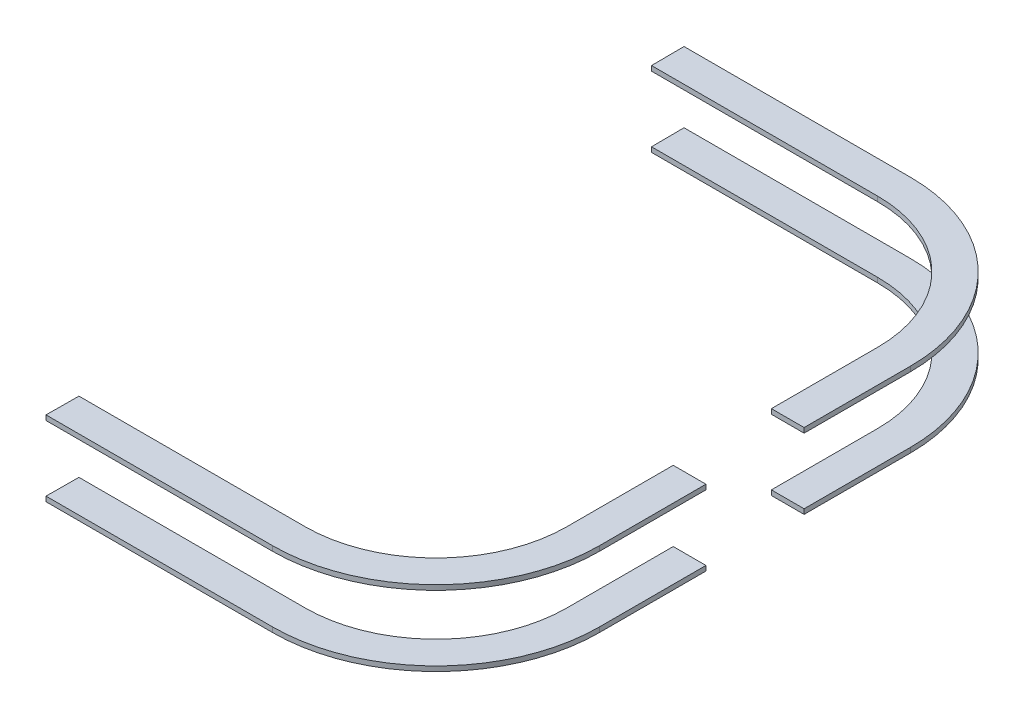
ISO-10303-21;
HEADER;
FILE_DESCRIPTION(('STEP AP214'),'2;1');
FILE_NAME('part.step','',(''),(''),'','','');
FILE_SCHEMA(('AUTOMOTIVE_DESIGN { 1 0 10303 214 1 1 1 1 }'));
ENDSEC;
DATA;
#1=APPLICATION_CONTEXT('core data for automotive mechanical design processes');
#2=APPLICATION_PROTOCOL_DEFINITION('international standard','automotive_design',2000,#1);
#3=PRODUCT_CONTEXT('',#1,'mechanical');
#4=PRODUCT('Part','Part','',(#3));
#5=PRODUCT_RELATED_PRODUCT_CATEGORY('part','',(#4));
#6=PRODUCT_DEFINITION_FORMATION('','',#4);
#7=PRODUCT_DEFINITION_CONTEXT('part definition',#1,'design');
#8=PRODUCT_DEFINITION('design','',#6,#7);
#9=PRODUCT_DEFINITION_SHAPE('','',#8);
#10=(LENGTH_UNIT() NAMED_UNIT(*) SI_UNIT(.MILLI.,.METRE.));
#11=(NAMED_UNIT(*) PLANE_ANGLE_UNIT() SI_UNIT($,.RADIAN.));
#12=(NAMED_UNIT(*) SI_UNIT($,.STERADIAN.) SOLID_ANGLE_UNIT());
#13=UNCERTAINTY_MEASURE_WITH_UNIT(LENGTH_MEASURE(1.E-05),#10,'distance_accuracy_value','');
#14=(GEOMETRIC_REPRESENTATION_CONTEXT(3) GLOBAL_UNCERTAINTY_ASSIGNED_CONTEXT((#13)) GLOBAL_UNIT_ASSIGNED_CONTEXT((#10,
#11,#12)) REPRESENTATION_CONTEXT('',''));
#15=CARTESIAN_POINT('',(0.,0.,0.));
#16=DIRECTION('',(0.,0.,1.));
#17=DIRECTION('',(1.,0.,0.));
#18=AXIS2_PLACEMENT_3D('',#15,#16,#17);
#19=CARTESIAN_POINT('',(-0.0726145105182899,-40.,9.99973635316753));
#20=DIRECTION('',(0.999973635316763,0.,0.00726145105182906));
#21=DIRECTION('',(0.00726145105182906,0.,-0.999973635316763));
#22=AXIS2_PLACEMENT_3D('',#19,#20,#21);
#23=PLANE('',#22);
#24=DIRECTION('',(-0.00726145105182906,0.,0.999973635316763));
#25=VECTOR('',#24,1.);
#26=CARTESIAN_POINT('',(-0.0726145105182899,-43.,9.99973635316753));
#27=LINE('',#26,#25);
#28=CARTESIAN_POINT('',(0.0726145105182899,-43.,-9.99973635316753));
#29=VERTEX_POINT('',#28);
#30=CARTESIAN_POINT('',(-0.0726145105182899,-43.,9.99973635316753));
#31=VERTEX_POINT('',#30);
#32=EDGE_CURVE('E229',#29,#31,#27,.T.);
#33=ORIENTED_EDGE('',*,*,#32,.T.);
#34=DIRECTION('',(0.,-1.,0.));
#35=VECTOR('',#34,1.);
#36=CARTESIAN_POINT('',(-0.0726145105182899,-40.,9.99973635316753));
#37=LINE('',#36,#35);
#38=CARTESIAN_POINT('',(-0.0726145105182899,-40.,9.99973635316753));
#39=VERTEX_POINT('',#38);
#40=EDGE_CURVE('E12',#39,#31,#37,.T.);
#41=ORIENTED_EDGE('',*,*,#40,.F.);
#42=DIRECTION('',(-0.00726145105182906,0.,0.999973635316763));
#43=VECTOR('',#42,1.);
#44=CARTESIAN_POINT('',(-0.0726145105182899,-40.,9.99973635316753));
#45=LINE('',#44,#43);
#46=CARTESIAN_POINT('',(0.0726145105182899,-40.,-9.99973635316753));
#47=VERTEX_POINT('',#46);
#48=EDGE_CURVE('E265',#47,#39,#45,.T.);
#49=ORIENTED_EDGE('',*,*,#48,.F.);
#50=DIRECTION('',(0.,-1.,0.));
#51=VECTOR('',#50,1.);
#52=CARTESIAN_POINT('',(0.0726145105182899,-40.,-9.99973635316753));
#53=LINE('',#52,#51);
#54=EDGE_CURVE('E266',#47,#29,#53,.T.);
#55=ORIENTED_EDGE('',*,*,#54,.T.);
#56=EDGE_LOOP('',(#33,#41,#49,#55));
#57=FACE_BOUND('',#56,.T.);
#58=ADVANCED_FACE('F56',(#57),#23,.F.);
#59=CARTESIAN_POINT('',(138.327385489482,-40.,9.99973635316748));
#60=DIRECTION('',(0.,0.,-1.));
#61=DIRECTION('',(-1.,0.,0.));
#62=AXIS2_PLACEMENT_3D('',#59,#60,#61);
#63=PLANE('',#62);
#64=DIRECTION('',(1.,0.,0.));
#65=VECTOR('',#64,1.);
#66=CARTESIAN_POINT('',(138.327385489482,-43.,9.99973635316748));
#67=LINE('',#66,#65);
#68=CARTESIAN_POINT('',(138.327385489482,-43.,9.99973635316746));
#69=VERTEX_POINT('',#68);
#70=EDGE_CURVE('E233',#31,#69,#67,.T.);
#71=ORIENTED_EDGE('',*,*,#70,.T.);
#72=DIRECTION('',(0.,-1.,0.));
#73=VECTOR('',#72,1.);
#74=CARTESIAN_POINT('',(138.327385489482,-40.,9.99973635316746));
#75=LINE('',#74,#73);
#76=CARTESIAN_POINT('',(138.327385489482,-40.,9.99973635316746));
#77=VERTEX_POINT('',#76);
#78=EDGE_CURVE('E67',#77,#69,#75,.T.);
#79=ORIENTED_EDGE('',*,*,#78,.F.);
#80=DIRECTION('',(1.,0.,0.));
#81=VECTOR('',#80,1.);
#82=CARTESIAN_POINT('',(99.9273854894817,-40.,9.99973635316753));
#83=LINE('',#82,#81);
#84=EDGE_CURVE('E443',#39,#77,#83,.T.);
#85=ORIENTED_EDGE('',*,*,#84,.F.);
#86=ORIENTED_EDGE('',*,*,#40,.T.);
#87=EDGE_LOOP('',(#71,#79,#85,#86));
#88=FACE_BOUND('',#87,.T.);
#89=ADVANCED_FACE('F403',(#88),#63,.F.);
#90=CARTESIAN_POINT('',(138.327385489482,-40.,-90.0002636468325));
#91=DIRECTION('',(0.,-1.,0.));
#92=DIRECTION('',(0.,0.,-1.));
#93=AXIS2_PLACEMENT_3D('',#90,#91,#92);
#94=CYLINDRICAL_SURFACE('',#93,100.);
#95=CARTESIAN_POINT('',(138.327385489482,-43.,-90.0002636468325));
#96=DIRECTION('',(0.,1.,0.));
#97=DIRECTION('',(0.,0.,-1.));
#98=AXIS2_PLACEMENT_3D('',#95,#96,#97);
#99=CIRCLE('',#98,100.);
#100=CARTESIAN_POINT('',(238.327385489482,-43.,-90.0002636468325));
#101=VERTEX_POINT('',#100);
#102=EDGE_CURVE('E240',#69,#101,#99,.T.);
#103=ORIENTED_EDGE('',*,*,#102,.T.);
#104=DIRECTION('',(0.,-1.,0.));
#105=VECTOR('',#104,1.);
#106=CARTESIAN_POINT('',(238.327385489482,-40.,-90.0002636468325));
#107=LINE('',#106,#105);
#108=CARTESIAN_POINT('',(238.327385489482,-40.,-90.0002636468325));
#109=VERTEX_POINT('',#108);
#110=EDGE_CURVE('E285',#109,#101,#107,.T.);
#111=ORIENTED_EDGE('',*,*,#110,.F.);
#112=CARTESIAN_POINT('',(138.327385489482,-40.,-90.0002636468325));
#113=DIRECTION('',(0.,1.,0.));
#114=DIRECTION('',(0.,0.,-1.));
#115=AXIS2_PLACEMENT_3D('',#112,#113,#114);
#116=CIRCLE('',#115,100.);
#117=EDGE_CURVE('E450',#77,#109,#116,.T.);
#118=ORIENTED_EDGE('',*,*,#117,.F.);
#119=ORIENTED_EDGE('',*,*,#78,.T.);
#120=EDGE_LOOP('',(#103,#111,#118,#119));
#121=FACE_BOUND('',#120,.T.);
#122=ADVANCED_FACE('F406',(#121),#94,.T.);
#123=CARTESIAN_POINT('',(238.327385489482,-40.,-95.0002636468325));
#124=DIRECTION('',(-1.,0.,0.));
#125=DIRECTION('',(0.,0.,1.));
#126=AXIS2_PLACEMENT_3D('',#123,#124,#125);
#127=PLANE('',#126);
#128=DIRECTION('',(0.,0.,-1.));
#129=VECTOR('',#128,1.);
#130=CARTESIAN_POINT('',(238.327385489482,-43.,-95.0002636468325));
#131=LINE('',#130,#129);
#132=CARTESIAN_POINT('',(238.327385489482,-43.,-155.000263646832));
#133=VERTEX_POINT('',#132);
#134=EDGE_CURVE('E248',#101,#133,#131,.T.);
#135=ORIENTED_EDGE('',*,*,#134,.T.);
#136=DIRECTION('',(0.,-1.,0.));
#137=VECTOR('',#136,1.);
#138=CARTESIAN_POINT('',(238.327385489482,-40.,-155.000263646832));
#139=LINE('',#138,#137);
#140=CARTESIAN_POINT('',(238.327385489482,-40.,-155.000263646832));
#141=VERTEX_POINT('',#140);
#142=EDGE_CURVE('E281',#141,#133,#139,.T.);
#143=ORIENTED_EDGE('',*,*,#142,.F.);
#144=DIRECTION('',(0.,0.,-1.));
#145=VECTOR('',#144,1.);
#146=CARTESIAN_POINT('',(238.327385489482,-40.,-95.0002636468325));
#147=LINE('',#146,#145);
#148=EDGE_CURVE('E453',#109,#141,#147,.T.);
#149=ORIENTED_EDGE('',*,*,#148,.F.);
#150=ORIENTED_EDGE('',*,*,#110,.T.);
#151=EDGE_LOOP('',(#135,#143,#149,#150));
#152=FACE_BOUND('',#151,.T.);
#153=ADVANCED_FACE('F410',(#152),#127,.F.);
#154=CARTESIAN_POINT('',(238.327385489482,-40.,-155.000263646832));
#155=DIRECTION('',(0.,0.,1.));
#156=DIRECTION('',(1.,0.,0.));
#157=AXIS2_PLACEMENT_3D('',#154,#155,#156);
#158=PLANE('',#157);
#159=DIRECTION('',(-1.,0.,0.));
#160=VECTOR('',#159,1.);
#161=CARTESIAN_POINT('',(238.327385489482,-43.,-155.000263646832));
#162=LINE('',#161,#160);
#163=CARTESIAN_POINT('',(218.327385489482,-43.,-155.000263646833));
#164=VERTEX_POINT('',#163);
#165=EDGE_CURVE('E251',#133,#164,#162,.T.);
#166=ORIENTED_EDGE('',*,*,#165,.T.);
#167=DIRECTION('',(0.,-1.,0.));
#168=VECTOR('',#167,1.);
#169=CARTESIAN_POINT('',(218.327385489482,-40.,-155.000263646833));
#170=LINE('',#169,#168);
#171=CARTESIAN_POINT('',(218.327385489482,-40.,-155.000263646833));
#172=VERTEX_POINT('',#171);
#173=EDGE_CURVE('E277',#172,#164,#170,.T.);
#174=ORIENTED_EDGE('',*,*,#173,.F.);
#175=DIRECTION('',(-1.,0.,0.));
#176=VECTOR('',#175,1.);
#177=CARTESIAN_POINT('',(238.327385489482,-40.,-155.000263646832));
#178=LINE('',#177,#176);
#179=EDGE_CURVE('E459',#141,#172,#178,.T.);
#180=ORIENTED_EDGE('',*,*,#179,.F.);
#181=ORIENTED_EDGE('',*,*,#142,.T.);
#182=EDGE_LOOP('',(#166,#174,#180,#181));
#183=FACE_BOUND('',#182,.T.);
#184=ADVANCED_FACE('F414',(#183),#158,.F.);
#185=CARTESIAN_POINT('',(218.327385489482,-40.,-95.0002636468325));
#186=DIRECTION('',(1.,0.,0.));
#187=DIRECTION('',(0.,0.,-1.));
#188=AXIS2_PLACEMENT_3D('',#185,#186,#187);
#189=PLANE('',#188);
#190=DIRECTION('',(0.,0.,1.));
#191=VECTOR('',#190,1.);
#192=CARTESIAN_POINT('',(218.327385489482,-43.,-95.0002636468325));
#193=LINE('',#192,#191);
#194=CARTESIAN_POINT('',(218.327385489482,-43.,-89.9997363531676));
#195=VERTEX_POINT('',#194);
#196=EDGE_CURVE('E255',#164,#195,#193,.T.);
#197=ORIENTED_EDGE('',*,*,#196,.T.);
#198=DIRECTION('',(0.,-1.,0.));
#199=VECTOR('',#198,1.);
#200=CARTESIAN_POINT('',(218.327385489482,-40.,-89.9997363531676));
#201=LINE('',#200,#199);
#202=CARTESIAN_POINT('',(218.327385489482,-40.,-89.9997363531676));
#203=VERTEX_POINT('',#202);
#204=EDGE_CURVE('E273',#203,#195,#201,.T.);
#205=ORIENTED_EDGE('',*,*,#204,.F.);
#206=DIRECTION('',(0.,0.,1.));
#207=VECTOR('',#206,1.);
#208=CARTESIAN_POINT('',(218.327385489482,-40.,-155.000263646833));
#209=LINE('',#208,#207);
#210=EDGE_CURVE('E463',#172,#203,#209,.T.);
#211=ORIENTED_EDGE('',*,*,#210,.F.);
#212=ORIENTED_EDGE('',*,*,#173,.T.);
#213=EDGE_LOOP('',(#197,#205,#211,#212));
#214=FACE_BOUND('',#213,.T.);
#215=ADVANCED_FACE('F418',(#214),#189,.F.);
#216=CARTESIAN_POINT('',(138.327385489482,-40.,-89.9997363531676));
#217=DIRECTION('',(0.,-1.,0.));
#218=DIRECTION('',(0.,0.,-1.));
#219=AXIS2_PLACEMENT_3D('',#216,#217,#218);
#220=CYLINDRICAL_SURFACE('',#219,80.);
#221=CARTESIAN_POINT('',(138.327385489482,-43.,-89.9997363531676));
#222=DIRECTION('',(0.,-1.,0.));
#223=DIRECTION('',(0.,0.,-1.));
#224=AXIS2_PLACEMENT_3D('',#221,#222,#223);
#225=CIRCLE('',#224,80.);
#226=CARTESIAN_POINT('',(138.327385489482,-43.,-9.99973635316756));
#227=VERTEX_POINT('',#226);
#228=EDGE_CURVE('E258',#195,#227,#225,.T.);
#229=ORIENTED_EDGE('',*,*,#228,.T.);
#230=DIRECTION('',(0.,-1.,0.));
#231=VECTOR('',#230,1.);
#232=CARTESIAN_POINT('',(138.327385489482,-40.,-9.99973635316756));
#233=LINE('',#232,#231);
#234=CARTESIAN_POINT('',(138.327385489482,-40.,-9.99973635316756));
#235=VERTEX_POINT('',#234);
#236=EDGE_CURVE('E269',#235,#227,#233,.T.);
#237=ORIENTED_EDGE('',*,*,#236,.F.);
#238=CARTESIAN_POINT('',(138.327385489482,-40.,-89.9997363531676));
#239=DIRECTION('',(0.,-1.,0.));
#240=DIRECTION('',(0.,0.,-1.));
#241=AXIS2_PLACEMENT_3D('',#238,#239,#240);
#242=CIRCLE('',#241,80.);
#243=EDGE_CURVE('E466',#203,#235,#242,.T.);
#244=ORIENTED_EDGE('',*,*,#243,.F.);
#245=ORIENTED_EDGE('',*,*,#204,.T.);
#246=EDGE_LOOP('',(#229,#237,#244,#245));
#247=FACE_BOUND('',#246,.T.);
#248=ADVANCED_FACE('F422',(#247),#220,.F.);
#249=CARTESIAN_POINT('',(0.0726145105182899,-40.,-9.99973635316753));
#250=DIRECTION('',(0.,0.,1.));
#251=DIRECTION('',(1.,0.,0.));
#252=AXIS2_PLACEMENT_3D('',#249,#250,#251);
#253=PLANE('',#252);
#254=DIRECTION('',(-1.,0.,0.));
#255=VECTOR('',#254,1.);
#256=CARTESIAN_POINT('',(0.0726145105182899,-43.,-9.99973635316753));
#257=LINE('',#256,#255);
#258=EDGE_CURVE('E262',#227,#29,#257,.T.);
#259=ORIENTED_EDGE('',*,*,#258,.T.);
#260=ORIENTED_EDGE('',*,*,#54,.F.);
#261=DIRECTION('',(-1.,0.,0.));
#262=VECTOR('',#261,1.);
#263=CARTESIAN_POINT('',(138.327385489482,-40.,-9.99973635316756));
#264=LINE('',#263,#262);
#265=EDGE_CURVE('E76',#235,#47,#264,.T.);
#266=ORIENTED_EDGE('',*,*,#265,.F.);
#267=ORIENTED_EDGE('',*,*,#236,.T.);
#268=EDGE_LOOP('',(#259,#260,#266,#267));
#269=FACE_BOUND('',#268,.T.);
#270=ADVANCED_FACE('F426',(#269),#253,.F.);
#271=CARTESIAN_POINT('',(138.327385489482,-40.,-89.9997363531676));
#272=DIRECTION('',(0.,-1.,0.));
#273=DIRECTION('',(0.,0.,-1.));
#274=AXIS2_PLACEMENT_3D('',#271,#272,#273);
#275=PLANE('',#274);
#276=ORIENTED_EDGE('',*,*,#48,.T.);
#277=ORIENTED_EDGE('',*,*,#84,.T.);
#278=ORIENTED_EDGE('',*,*,#117,.T.);
#279=ORIENTED_EDGE('',*,*,#148,.T.);
#280=ORIENTED_EDGE('',*,*,#179,.T.);
#281=ORIENTED_EDGE('',*,*,#210,.T.);
#282=ORIENTED_EDGE('',*,*,#243,.T.);
#283=ORIENTED_EDGE('',*,*,#265,.T.);
#284=EDGE_LOOP('',(#276,#277,#278,#279,#280,#281,#282,#283));
#285=FACE_BOUND('',#284,.T.);
#286=ADVANCED_FACE('F430',(#285),#275,.F.);
#287=CARTESIAN_POINT('',(138.327385489482,-43.,-89.9997363531676));
#288=DIRECTION('',(0.,-1.,0.));
#289=DIRECTION('',(0.,0.,-1.));
#290=AXIS2_PLACEMENT_3D('',#287,#288,#289);
#291=PLANE('',#290);
#292=ORIENTED_EDGE('',*,*,#32,.F.);
#293=ORIENTED_EDGE('',*,*,#258,.F.);
#294=ORIENTED_EDGE('',*,*,#228,.F.);
#295=ORIENTED_EDGE('',*,*,#196,.F.);
#296=ORIENTED_EDGE('',*,*,#165,.F.);
#297=ORIENTED_EDGE('',*,*,#134,.F.);
#298=ORIENTED_EDGE('',*,*,#102,.F.);
#299=ORIENTED_EDGE('',*,*,#70,.F.);
#300=EDGE_LOOP('',(#292,#293,#294,#295,#296,#297,#298,#299));
#301=FACE_BOUND('',#300,.T.);
#302=ADVANCED_FACE('F432',(#301),#291,.T.);
#303=CLOSED_SHELL('',(#58,#89,#122,#153,#184,#215,#248,#270,#286,#302));
#304=MANIFOLD_SOLID_BREP('B2',#303);
#305=CARTESIAN_POINT('',(138.327385489482,-40.,-280.000263646832));
#306=DIRECTION('',(0.,-1.,0.));
#307=DIRECTION('',(0.,0.,-1.));
#308=AXIS2_PLACEMENT_3D('',#305,#306,#307);
#309=CYLINDRICAL_SURFACE('',#308,100.);
#310=CARTESIAN_POINT('',(138.327385489482,-43.,-280.000263646832));
#311=DIRECTION('',(0.,1.,0.));
#312=DIRECTION('',(0.,0.,1.));
#313=AXIS2_PLACEMENT_3D('',#310,#311,#312);
#314=CIRCLE('',#313,100.);
#315=CARTESIAN_POINT('',(238.327385489482,-43.,-280.000263646832));
#316=VERTEX_POINT('',#315);
#317=CARTESIAN_POINT('',(138.327385489482,-43.,-380.000263646832));
#318=VERTEX_POINT('',#317);
#319=EDGE_CURVE('E173',#316,#318,#314,.T.);
#320=ORIENTED_EDGE('',*,*,#319,.T.);
#321=DIRECTION('',(0.,-1.,0.));
#322=VECTOR('',#321,1.);
#323=CARTESIAN_POINT('',(138.327385489482,-40.,-380.000263646832));
#324=LINE('',#323,#322);
#325=CARTESIAN_POINT('',(138.327385489482,-40.,-380.000263646832));
#326=VERTEX_POINT('',#325);
#327=EDGE_CURVE('E60',#326,#318,#324,.T.);
#328=ORIENTED_EDGE('',*,*,#327,.F.);
#329=CARTESIAN_POINT('',(138.327385489482,-40.,-280.000263646832));
#330=DIRECTION('',(0.,1.,0.));
#331=DIRECTION('',(0.,0.,1.));
#332=AXIS2_PLACEMENT_3D('',#329,#330,#331);
#333=CIRCLE('',#332,100.);
#334=CARTESIAN_POINT('',(238.327385489482,-40.,-280.000263646832));
#335=VERTEX_POINT('',#334);
#336=EDGE_CURVE('E167',#335,#326,#333,.T.);
#337=ORIENTED_EDGE('',*,*,#336,.F.);
#338=DIRECTION('',(0.,-1.,0.));
#339=VECTOR('',#338,1.);
#340=CARTESIAN_POINT('',(238.327385489482,-40.,-280.000263646832));
#341=LINE('',#340,#339);
#342=EDGE_CURVE('E162',#335,#316,#341,.T.);
#343=ORIENTED_EDGE('',*,*,#342,.T.);
#344=EDGE_LOOP('',(#320,#328,#337,#343));
#345=FACE_BOUND('',#344,.T.);
#346=ADVANCED_FACE('F58',(#345),#309,.T.);
#347=CARTESIAN_POINT('',(99.9273854894817,-40.,-380.000263646832));
#348=DIRECTION('',(0.,0.,1.));
#349=DIRECTION('',(1.,0.,0.));
#350=AXIS2_PLACEMENT_3D('',#347,#348,#349);
#351=PLANE('',#350);
#352=DIRECTION('',(-1.,0.,0.));
#353=VECTOR('',#352,1.);
#354=CARTESIAN_POINT('',(99.9273854894817,-43.,-380.000263646832));
#355=LINE('',#354,#353);
#356=CARTESIAN_POINT('',(-0.0726145105183246,-43.,-380.000263646832));
#357=VERTEX_POINT('',#356);
#358=EDGE_CURVE('E180',#318,#357,#355,.T.);
#359=ORIENTED_EDGE('',*,*,#358,.T.);
#360=DIRECTION('',(0.,-1.,0.));
#361=VECTOR('',#360,1.);
#362=CARTESIAN_POINT('',(-0.0726145105183246,-40.,-380.000263646832));
#363=LINE('',#362,#361);
#364=CARTESIAN_POINT('',(-0.0726145105183246,-40.,-380.000263646832));
#365=VERTEX_POINT('',#364);
#366=EDGE_CURVE('E222',#365,#357,#363,.T.);
#367=ORIENTED_EDGE('',*,*,#366,.F.);
#368=DIRECTION('',(-1.,0.,0.));
#369=VECTOR('',#368,1.);
#370=CARTESIAN_POINT('',(138.327385489482,-40.,-380.000263646832));
#371=LINE('',#370,#369);
#372=EDGE_CURVE('E294',#326,#365,#371,.T.);
#373=ORIENTED_EDGE('',*,*,#372,.F.);
#374=ORIENTED_EDGE('',*,*,#327,.T.);
#375=EDGE_LOOP('',(#359,#367,#373,#374));
#376=FACE_BOUND('',#375,.T.);
#377=ADVANCED_FACE('F315',(#376),#351,.F.);
#378=CARTESIAN_POINT('',(-0.0726145105183246,-40.,-380.000263646832));
#379=DIRECTION('',(0.999973635316763,0.,-0.00726145105182923));
#380=DIRECTION('',(-0.00726145105182923,0.,-0.999973635316763));
#381=AXIS2_PLACEMENT_3D('',#378,#379,#380);
#382=PLANE('',#381);
#383=DIRECTION('',(0.00726145105182923,0.,0.999973635316763));
#384=VECTOR('',#383,1.);
#385=CARTESIAN_POINT('',(-0.0726145105183246,-43.,-380.000263646832));
#386=LINE('',#385,#384);
#387=CARTESIAN_POINT('',(0.0726145105182587,-43.,-360.000790940497));
#388=VERTEX_POINT('',#387);
#389=EDGE_CURVE('E185',#357,#388,#386,.T.);
#390=ORIENTED_EDGE('',*,*,#389,.T.);
#391=DIRECTION('',(0.,-1.,0.));
#392=VECTOR('',#391,1.);
#393=CARTESIAN_POINT('',(0.0726145105182587,-40.,-360.000790940497));
#394=LINE('',#393,#392);
#395=CARTESIAN_POINT('',(0.0726145105182587,-40.,-360.000790940497));
#396=VERTEX_POINT('',#395);
#397=EDGE_CURVE('E219',#396,#388,#394,.T.);
#398=ORIENTED_EDGE('',*,*,#397,.F.);
#399=DIRECTION('',(0.00726145105182923,0.,0.999973635316763));
#400=VECTOR('',#399,1.);
#401=CARTESIAN_POINT('',(-0.0726145105183246,-40.,-380.000263646832));
#402=LINE('',#401,#400);
#403=EDGE_CURVE('E297',#365,#396,#402,.T.);
#404=ORIENTED_EDGE('',*,*,#403,.F.);
#405=ORIENTED_EDGE('',*,*,#366,.T.);
#406=EDGE_LOOP('',(#390,#398,#404,#405));
#407=FACE_BOUND('',#406,.T.);
#408=ADVANCED_FACE('F316',(#407),#382,.F.);
#409=CARTESIAN_POINT('',(138.327385489482,-40.,-360.000790940497));
#410=DIRECTION('',(0.,0.,-1.));
#411=DIRECTION('',(-1.,0.,0.));
#412=AXIS2_PLACEMENT_3D('',#409,#410,#411);
#413=PLANE('',#412);
#414=DIRECTION('',(1.,0.,0.));
#415=VECTOR('',#414,1.);
#416=CARTESIAN_POINT('',(138.327385489482,-43.,-360.000790940497));
#417=LINE('',#416,#415);
#418=CARTESIAN_POINT('',(138.327385489482,-43.,-360.000790940497));
#419=VERTEX_POINT('',#418);
#420=EDGE_CURVE('E193',#388,#419,#417,.T.);
#421=ORIENTED_EDGE('',*,*,#420,.T.);
#422=DIRECTION('',(0.,-1.,0.));
#423=VECTOR('',#422,1.);
#424=CARTESIAN_POINT('',(138.327385489482,-40.,-360.000790940497));
#425=LINE('',#424,#423);
#426=CARTESIAN_POINT('',(138.327385489482,-40.,-360.000790940497));
#427=VERTEX_POINT('',#426);
#428=EDGE_CURVE('E215',#427,#419,#425,.T.);
#429=ORIENTED_EDGE('',*,*,#428,.F.);
#430=DIRECTION('',(1.,0.,0.));
#431=VECTOR('',#430,1.);
#432=CARTESIAN_POINT('',(0.0726145105182587,-40.,-360.000790940497));
#433=LINE('',#432,#431);
#434=EDGE_CURVE('E300',#396,#427,#433,.T.);
#435=ORIENTED_EDGE('',*,*,#434,.F.);
#436=ORIENTED_EDGE('',*,*,#397,.T.);
#437=EDGE_LOOP('',(#421,#429,#435,#436));
#438=FACE_BOUND('',#437,.T.);
#439=ADVANCED_FACE('F320',(#438),#413,.F.);
#440=CARTESIAN_POINT('',(138.327385489482,-40.,-280.000790940497));
#441=DIRECTION('',(0.,-1.,0.));
#442=DIRECTION('',(0.,0.,-1.));
#443=AXIS2_PLACEMENT_3D('',#440,#441,#442);
#444=CYLINDRICAL_SURFACE('',#443,80.);
#445=CARTESIAN_POINT('',(138.327385489482,-43.,-280.000790940497));
#446=DIRECTION('',(0.,-1.,0.));
#447=DIRECTION('',(0.,0.,1.));
#448=AXIS2_PLACEMENT_3D('',#445,#446,#447);
#449=CIRCLE('',#448,80.);
#450=CARTESIAN_POINT('',(218.327385489482,-43.,-280.000790940497));
#451=VERTEX_POINT('',#450);
#452=EDGE_CURVE('E196',#419,#451,#449,.T.);
#453=ORIENTED_EDGE('',*,*,#452,.T.);
#454=DIRECTION('',(0.,-1.,0.));
#455=VECTOR('',#454,1.);
#456=CARTESIAN_POINT('',(218.327385489482,-40.,-280.000790940497));
#457=LINE('',#456,#455);
#458=CARTESIAN_POINT('',(218.327385489482,-40.,-280.000790940497));
#459=VERTEX_POINT('',#458);
#460=EDGE_CURVE('E211',#459,#451,#457,.T.);
#461=ORIENTED_EDGE('',*,*,#460,.F.);
#462=CARTESIAN_POINT('',(138.327385489482,-40.,-280.000790940497));
#463=DIRECTION('',(0.,-1.,0.));
#464=DIRECTION('',(0.,0.,1.));
#465=AXIS2_PLACEMENT_3D('',#462,#463,#464);
#466=CIRCLE('',#465,80.);
#467=EDGE_CURVE('E303',#427,#459,#466,.T.);
#468=ORIENTED_EDGE('',*,*,#467,.F.);
#469=ORIENTED_EDGE('',*,*,#428,.T.);
#470=EDGE_LOOP('',(#453,#461,#468,#469));
#471=FACE_BOUND('',#470,.T.);
#472=ADVANCED_FACE('F326',(#471),#444,.F.);
#473=CARTESIAN_POINT('',(218.327385489482,-40.,-215.000263646832));
#474=DIRECTION('',(1.,0.,0.));
#475=DIRECTION('',(0.,0.,-1.));
#476=AXIS2_PLACEMENT_3D('',#473,#474,#475);
#477=PLANE('',#476);
#478=DIRECTION('',(0.,0.,1.));
#479=VECTOR('',#478,1.);
#480=CARTESIAN_POINT('',(218.327385489482,-43.,-215.000263646832));
#481=LINE('',#480,#479);
#482=CARTESIAN_POINT('',(218.327385489482,-43.,-215.000263646832));
#483=VERTEX_POINT('',#482);
#484=EDGE_CURVE('E200',#451,#483,#481,.T.);
#485=ORIENTED_EDGE('',*,*,#484,.T.);
#486=DIRECTION('',(0.,-1.,0.));
#487=VECTOR('',#486,1.);
#488=CARTESIAN_POINT('',(218.327385489482,-40.,-215.000263646832));
#489=LINE('',#488,#487);
#490=CARTESIAN_POINT('',(218.327385489482,-40.,-215.000263646832));
#491=VERTEX_POINT('',#490);
#492=EDGE_CURVE('E207',#491,#483,#489,.T.);
#493=ORIENTED_EDGE('',*,*,#492,.F.);
#494=DIRECTION('',(0.,0.,1.));
#495=VECTOR('',#494,1.);
#496=CARTESIAN_POINT('',(218.327385489482,-40.,-275.000263646832));
#497=LINE('',#496,#495);
#498=EDGE_CURVE('E306',#459,#491,#497,.T.);
#499=ORIENTED_EDGE('',*,*,#498,.F.);
#500=ORIENTED_EDGE('',*,*,#460,.T.);
#501=EDGE_LOOP('',(#485,#493,#499,#500));
#502=FACE_BOUND('',#501,.T.);
#503=ADVANCED_FACE('F329',(#502),#477,.F.);
#504=CARTESIAN_POINT('',(238.327385489482,-40.,-215.000263646832));
#505=DIRECTION('',(0.,0.,-1.));
#506=DIRECTION('',(-1.,0.,0.));
#507=AXIS2_PLACEMENT_3D('',#504,#505,#506);
#508=PLANE('',#507);
#509=DIRECTION('',(1.,0.,0.));
#510=VECTOR('',#509,1.);
#511=CARTESIAN_POINT('',(238.327385489482,-43.,-215.000263646832));
#512=LINE('',#511,#510);
#513=CARTESIAN_POINT('',(238.327385489482,-43.,-215.000263646832));
#514=VERTEX_POINT('',#513);
#515=EDGE_CURVE('E168',#483,#514,#512,.T.);
#516=ORIENTED_EDGE('',*,*,#515,.T.);
#517=DIRECTION('',(0.,-1.,0.));
#518=VECTOR('',#517,1.);
#519=CARTESIAN_POINT('',(238.327385489482,-40.,-215.000263646832));
#520=LINE('',#519,#518);
#521=CARTESIAN_POINT('',(238.327385489482,-40.,-215.000263646832));
#522=VERTEX_POINT('',#521);
#523=EDGE_CURVE('E165',#522,#514,#520,.T.);
#524=ORIENTED_EDGE('',*,*,#523,.F.);
#525=DIRECTION('',(1.,0.,0.));
#526=VECTOR('',#525,1.);
#527=CARTESIAN_POINT('',(238.327385489482,-40.,-215.000263646832));
#528=LINE('',#527,#526);
#529=EDGE_CURVE('E308',#491,#522,#528,.T.);
#530=ORIENTED_EDGE('',*,*,#529,.F.);
#531=ORIENTED_EDGE('',*,*,#492,.T.);
#532=EDGE_LOOP('',(#516,#524,#530,#531));
#533=FACE_BOUND('',#532,.T.);
#534=ADVANCED_FACE('F331',(#533),#508,.F.);
#535=CARTESIAN_POINT('',(238.327385489482,-40.,-275.000263646832));
#536=DIRECTION('',(-1.,0.,0.));
#537=DIRECTION('',(0.,0.,1.));
#538=AXIS2_PLACEMENT_3D('',#535,#536,#537);
#539=PLANE('',#538);
#540=DIRECTION('',(0.,0.,-1.));
#541=VECTOR('',#540,1.);
#542=CARTESIAN_POINT('',(238.327385489482,-43.,-275.000263646832));
#543=LINE('',#542,#541);
#544=EDGE_CURVE('E154',#514,#316,#543,.T.);
#545=ORIENTED_EDGE('',*,*,#544,.T.);
#546=ORIENTED_EDGE('',*,*,#342,.F.);
#547=DIRECTION('',(0.,0.,-1.));
#548=VECTOR('',#547,1.);
#549=CARTESIAN_POINT('',(238.327385489482,-40.,-275.000263646832));
#550=LINE('',#549,#548);
#551=EDGE_CURVE('E176',#522,#335,#550,.T.);
#552=ORIENTED_EDGE('',*,*,#551,.F.);
#553=ORIENTED_EDGE('',*,*,#523,.T.);
#554=EDGE_LOOP('',(#545,#546,#552,#553));
#555=FACE_BOUND('',#554,.T.);
#556=ADVANCED_FACE('F160',(#555),#539,.F.);
#557=CARTESIAN_POINT('',(138.327385489482,-40.,-280.000263646832));
#558=DIRECTION('',(0.,1.,0.));
#559=DIRECTION('',(0.,0.,1.));
#560=AXIS2_PLACEMENT_3D('',#557,#558,#559);
#561=PLANE('',#560);
#562=ORIENTED_EDGE('',*,*,#336,.T.);
#563=ORIENTED_EDGE('',*,*,#372,.T.);
#564=ORIENTED_EDGE('',*,*,#403,.T.);
#565=ORIENTED_EDGE('',*,*,#434,.T.);
#566=ORIENTED_EDGE('',*,*,#467,.T.);
#567=ORIENTED_EDGE('',*,*,#498,.T.);
#568=ORIENTED_EDGE('',*,*,#529,.T.);
#569=ORIENTED_EDGE('',*,*,#551,.T.);
#570=EDGE_LOOP('',(#562,#563,#564,#565,#566,#567,#568,#569));
#571=FACE_BOUND('',#570,.T.);
#572=ADVANCED_FACE('F313',(#571),#561,.T.);
#573=CARTESIAN_POINT('',(138.327385489482,-43.,-280.000263646832));
#574=DIRECTION('',(0.,1.,0.));
#575=DIRECTION('',(0.,0.,1.));
#576=AXIS2_PLACEMENT_3D('',#573,#574,#575);
#577=PLANE('',#576);
#578=ORIENTED_EDGE('',*,*,#319,.F.);
#579=ORIENTED_EDGE('',*,*,#544,.F.);
#580=ORIENTED_EDGE('',*,*,#515,.F.);
#581=ORIENTED_EDGE('',*,*,#484,.F.);
#582=ORIENTED_EDGE('',*,*,#452,.F.);
#583=ORIENTED_EDGE('',*,*,#420,.F.);
#584=ORIENTED_EDGE('',*,*,#389,.F.);
#585=ORIENTED_EDGE('',*,*,#358,.F.);
#586=EDGE_LOOP('',(#578,#579,#580,#581,#582,#583,#584,#585));
#587=FACE_BOUND('',#586,.T.);
#588=ADVANCED_FACE('F178',(#587),#577,.F.);
#589=CLOSED_SHELL('',(#346,#377,#408,#439,#472,#503,#534,#556,#572,#588));
#590=MANIFOLD_SOLID_BREP('B2',#589);
#591=CARTESIAN_POINT('',(138.327385489482,3.,-280.000263646832));
#592=DIRECTION('',(0.,-1.,0.));
#593=DIRECTION('',(0.,0.,-1.));
#594=AXIS2_PLACEMENT_3D('',#591,#592,#593);
#595=CYLINDRICAL_SURFACE('',#594,100.);
#596=CARTESIAN_POINT('',(138.327385489482,0.,-280.000263646832));
#597=DIRECTION('',(0.,1.,0.));
#598=DIRECTION('',(0.,0.,1.));
#599=AXIS2_PLACEMENT_3D('',#596,#597,#598);
#600=CIRCLE('',#599,100.);
#601=CARTESIAN_POINT('',(238.327385489482,0.,-280.000263646832));
#602=VERTEX_POINT('',#601);
#603=CARTESIAN_POINT('',(138.327385489482,0.,-380.000263646832));
#604=VERTEX_POINT('',#603);
#605=EDGE_CURVE('E54',#602,#604,#600,.T.);
#606=ORIENTED_EDGE('',*,*,#605,.T.);
#607=DIRECTION('',(0.,-1.,0.));
#608=VECTOR('',#607,1.);
#609=CARTESIAN_POINT('',(138.327385489482,3.,-380.000263646832));
#610=LINE('',#609,#608);
#611=CARTESIAN_POINT('',(138.327385489482,3.,-380.000263646832));
#612=VERTEX_POINT('',#611);
#613=EDGE_CURVE('E693',#612,#604,#610,.T.);
#614=ORIENTED_EDGE('',*,*,#613,.F.);
#615=CARTESIAN_POINT('',(138.327385489482,3.,-280.000263646832));
#616=DIRECTION('',(0.,1.,0.));
#617=DIRECTION('',(0.,0.,1.));
#618=AXIS2_PLACEMENT_3D('',#615,#616,#617);
#619=CIRCLE('',#618,100.);
#620=CARTESIAN_POINT('',(238.327385489482,3.,-280.000263646832));
#621=VERTEX_POINT('',#620);
#622=EDGE_CURVE('E600',#621,#612,#619,.T.);
#623=ORIENTED_EDGE('',*,*,#622,.F.);
#624=DIRECTION('',(0.,-1.,0.));
#625=VECTOR('',#624,1.);
#626=CARTESIAN_POINT('',(238.327385489482,3.,-280.000263646832));
#627=LINE('',#626,#625);
#628=EDGE_CURVE('E704',#621,#602,#627,.T.);
#629=ORIENTED_EDGE('',*,*,#628,.T.);
#630=EDGE_LOOP('',(#606,#614,#623,#629));
#631=FACE_BOUND('',#630,.T.);
#632=ADVANCED_FACE('F596',(#631),#595,.T.);
#633=CARTESIAN_POINT('',(99.9273854894817,3.,-380.000263646832));
#634=DIRECTION('',(0.,0.,1.));
#635=DIRECTION('',(1.,0.,0.));
#636=AXIS2_PLACEMENT_3D('',#633,#634,#635);
#637=PLANE('',#636);
#638=DIRECTION('',(-1.,0.,0.));
#639=VECTOR('',#638,1.);
#640=CARTESIAN_POINT('',(99.9273854894817,0.,-380.000263646832));
#641=LINE('',#640,#639);
#642=CARTESIAN_POINT('',(-0.0726145105183246,0.,-380.000263646832));
#643=VERTEX_POINT('',#642);
#644=EDGE_CURVE('E606',#604,#643,#641,.T.);
#645=ORIENTED_EDGE('',*,*,#644,.T.);
#646=DIRECTION('',(0.,-1.,0.));
#647=VECTOR('',#646,1.);
#648=CARTESIAN_POINT('',(-0.0726145105183246,3.,-380.000263646832));
#649=LINE('',#648,#647);
#650=CARTESIAN_POINT('',(-0.0726145105183246,3.,-380.000263646832));
#651=VERTEX_POINT('',#650);
#652=EDGE_CURVE('E685',#651,#643,#649,.T.);
#653=ORIENTED_EDGE('',*,*,#652,.F.);
#654=DIRECTION('',(-1.,0.,0.));
#655=VECTOR('',#654,1.);
#656=CARTESIAN_POINT('',(138.327385489482,3.,-380.000263646832));
#657=LINE('',#656,#655);
#658=EDGE_CURVE('E642',#612,#651,#657,.T.);
#659=ORIENTED_EDGE('',*,*,#658,.F.);
#660=ORIENTED_EDGE('',*,*,#613,.T.);
#661=EDGE_LOOP('',(#645,#653,#659,#660));
#662=FACE_BOUND('',#661,.T.);
#663=ADVANCED_FACE('F728',(#662),#637,.F.);
#664=CARTESIAN_POINT('',(-0.0726145105183246,3.,-380.000263646832));
#665=DIRECTION('',(0.999973635316763,0.,-0.00726145105182923));
#666=DIRECTION('',(-0.00726145105182923,0.,-0.999973635316763));
#667=AXIS2_PLACEMENT_3D('',#664,#665,#666);
#668=PLANE('',#667);
#669=DIRECTION('',(0.00726145105182923,0.,0.999973635316763));
#670=VECTOR('',#669,1.);
#671=CARTESIAN_POINT('',(-0.0726145105183246,0.,-380.000263646832));
#672=LINE('',#671,#670);
#673=CARTESIAN_POINT('',(0.0726145105182587,0.,-360.000790940497));
#674=VERTEX_POINT('',#673);
#675=EDGE_CURVE('E670',#643,#674,#672,.T.);
#676=ORIENTED_EDGE('',*,*,#675,.T.);
#677=DIRECTION('',(0.,-1.,0.));
#678=VECTOR('',#677,1.);
#679=CARTESIAN_POINT('',(0.0726145105182587,3.,-360.000790940497));
#680=LINE('',#679,#678);
#681=CARTESIAN_POINT('',(0.0726145105182587,3.,-360.000790940497));
#682=VERTEX_POINT('',#681);
#683=EDGE_CURVE('E683',#682,#674,#680,.T.);
#684=ORIENTED_EDGE('',*,*,#683,.F.);
#685=DIRECTION('',(0.00726145105182923,0.,0.999973635316763));
#686=VECTOR('',#685,1.);
#687=CARTESIAN_POINT('',(-0.0726145105183246,3.,-380.000263646832));
#688=LINE('',#687,#686);
#689=EDGE_CURVE('E723',#651,#682,#688,.T.);
#690=ORIENTED_EDGE('',*,*,#689,.F.);
#691=ORIENTED_EDGE('',*,*,#652,.T.);
#692=EDGE_LOOP('',(#676,#684,#690,#691));
#693=FACE_BOUND('',#692,.T.);
#694=ADVANCED_FACE('F681',(#693),#668,.F.);
#695=CARTESIAN_POINT('',(138.327385489482,3.,-360.000790940497));
#696=DIRECTION('',(0.,0.,-1.));
#697=DIRECTION('',(-1.,0.,0.));
#698=AXIS2_PLACEMENT_3D('',#695,#696,#697);
#699=PLANE('',#698);
#700=DIRECTION('',(1.,0.,0.));
#701=VECTOR('',#700,1.);
#702=CARTESIAN_POINT('',(138.327385489482,0.,-360.000790940497));
#703=LINE('',#702,#701);
#704=CARTESIAN_POINT('',(138.327385489482,0.,-360.000790940497));
#705=VERTEX_POINT('',#704);
#706=EDGE_CURVE('E667',#674,#705,#703,.T.);
#707=ORIENTED_EDGE('',*,*,#706,.T.);
#708=DIRECTION('',(0.,-1.,0.));
#709=VECTOR('',#708,1.);
#710=CARTESIAN_POINT('',(138.327385489482,3.,-360.000790940497));
#711=LINE('',#710,#709);
#712=CARTESIAN_POINT('',(138.327385489482,3.,-360.000790940497));
#713=VERTEX_POINT('',#712);
#714=EDGE_CURVE('E689',#713,#705,#711,.T.);
#715=ORIENTED_EDGE('',*,*,#714,.F.);
#716=DIRECTION('',(1.,0.,0.));
#717=VECTOR('',#716,1.);
#718=CARTESIAN_POINT('',(0.0726145105182587,3.,-360.000790940497));
#719=LINE('',#718,#717);
#720=EDGE_CURVE('E688',#682,#713,#719,.T.);
#721=ORIENTED_EDGE('',*,*,#720,.F.);
#722=ORIENTED_EDGE('',*,*,#683,.T.);
#723=EDGE_LOOP('',(#707,#715,#721,#722));
#724=FACE_BOUND('',#723,.T.);
#725=ADVANCED_FACE('F687',(#724),#699,.F.);
#726=CARTESIAN_POINT('',(138.327385489482,3.,-280.000790940497));
#727=DIRECTION('',(0.,-1.,0.));
#728=DIRECTION('',(0.,0.,-1.));
#729=AXIS2_PLACEMENT_3D('',#726,#727,#728);
#730=CYLINDRICAL_SURFACE('',#729,80.);
#731=CARTESIAN_POINT('',(138.327385489482,0.,-280.000790940497));
#732=DIRECTION('',(0.,-1.,0.));
#733=DIRECTION('',(0.,0.,1.));
#734=AXIS2_PLACEMENT_3D('',#731,#732,#733);
#735=CIRCLE('',#734,80.);
#736=CARTESIAN_POINT('',(218.327385489482,0.,-280.000790940497));
#737=VERTEX_POINT('',#736);
#738=EDGE_CURVE('E672',#705,#737,#735,.T.);
#739=ORIENTED_EDGE('',*,*,#738,.T.);
#740=DIRECTION('',(0.,-1.,0.));
#741=VECTOR('',#740,1.);
#742=CARTESIAN_POINT('',(218.327385489482,3.,-280.000790940497));
#743=LINE('',#742,#741);
#744=CARTESIAN_POINT('',(218.327385489482,3.,-280.000790940497));
#745=VERTEX_POINT('',#744);
#746=EDGE_CURVE('E691',#745,#737,#743,.T.);
#747=ORIENTED_EDGE('',*,*,#746,.F.);
#748=CARTESIAN_POINT('',(138.327385489482,3.,-280.000790940497));
#749=DIRECTION('',(0.,-1.,0.));
#750=DIRECTION('',(0.,0.,1.));
#751=AXIS2_PLACEMENT_3D('',#748,#749,#750);
#752=CIRCLE('',#751,80.);
#753=EDGE_CURVE('E720',#713,#745,#752,.T.);
#754=ORIENTED_EDGE('',*,*,#753,.F.);
#755=ORIENTED_EDGE('',*,*,#714,.T.);
#756=EDGE_LOOP('',(#739,#747,#754,#755));
#757=FACE_BOUND('',#756,.T.);
#758=ADVANCED_FACE('F732',(#757),#730,.F.);
#759=CARTESIAN_POINT('',(218.327385489482,3.,-215.000263646832));
#760=DIRECTION('',(1.,0.,0.));
#761=DIRECTION('',(0.,0.,-1.));
#762=AXIS2_PLACEMENT_3D('',#759,#760,#761);
#763=PLANE('',#762);
#764=DIRECTION('',(0.,0.,1.));
#765=VECTOR('',#764,1.);
#766=CARTESIAN_POINT('',(218.327385489482,0.,-215.000263646832));
#767=LINE('',#766,#765);
#768=CARTESIAN_POINT('',(218.327385489482,0.,-215.000263646832));
#769=VERTEX_POINT('',#768);
#770=EDGE_CURVE('E711',#737,#769,#767,.T.);
#771=ORIENTED_EDGE('',*,*,#770,.T.);
#772=DIRECTION('',(0.,-1.,0.));
#773=VECTOR('',#772,1.);
#774=CARTESIAN_POINT('',(218.327385489482,3.,-215.000263646832));
#775=LINE('',#774,#773);
#776=CARTESIAN_POINT('',(218.327385489482,3.,-215.000263646832));
#777=VERTEX_POINT('',#776);
#778=EDGE_CURVE('E699',#777,#769,#775,.T.);
#779=ORIENTED_EDGE('',*,*,#778,.F.);
#780=DIRECTION('',(0.,0.,1.));
#781=VECTOR('',#780,1.);
#782=CARTESIAN_POINT('',(218.327385489482,3.,-275.000263646832));
#783=LINE('',#782,#781);
#784=EDGE_CURVE('E718',#745,#777,#783,.T.);
#785=ORIENTED_EDGE('',*,*,#784,.F.);
#786=ORIENTED_EDGE('',*,*,#746,.T.);
#787=EDGE_LOOP('',(#771,#779,#785,#786));
#788=FACE_BOUND('',#787,.T.);
#789=ADVANCED_FACE('F736',(#788),#763,.F.);
#790=CARTESIAN_POINT('',(238.327385489482,3.,-215.000263646832));
#791=DIRECTION('',(0.,0.,-1.));
#792=DIRECTION('',(-1.,0.,0.));
#793=AXIS2_PLACEMENT_3D('',#790,#791,#792);
#794=PLANE('',#793);
#795=DIRECTION('',(1.,0.,0.));
#796=VECTOR('',#795,1.);
#797=CARTESIAN_POINT('',(238.327385489482,0.,-215.000263646832));
#798=LINE('',#797,#796);
#799=CARTESIAN_POINT('',(238.327385489482,0.,-215.000263646832));
#800=VERTEX_POINT('',#799);
#801=EDGE_CURVE('E708',#769,#800,#798,.T.);
#802=ORIENTED_EDGE('',*,*,#801,.T.);
#803=DIRECTION('',(0.,-1.,0.));
#804=VECTOR('',#803,1.);
#805=CARTESIAN_POINT('',(238.327385489482,3.,-215.000263646832));
#806=LINE('',#805,#804);
#807=CARTESIAN_POINT('',(238.327385489482,3.,-215.000263646832));
#808=VERTEX_POINT('',#807);
#809=EDGE_CURVE('E702',#808,#800,#806,.T.);
#810=ORIENTED_EDGE('',*,*,#809,.F.);
#811=DIRECTION('',(1.,0.,0.));
#812=VECTOR('',#811,1.);
#813=CARTESIAN_POINT('',(238.327385489482,3.,-215.000263646832));
#814=LINE('',#813,#812);
#815=EDGE_CURVE('E716',#777,#808,#814,.T.);
#816=ORIENTED_EDGE('',*,*,#815,.F.);
#817=ORIENTED_EDGE('',*,*,#778,.T.);
#818=EDGE_LOOP('',(#802,#810,#816,#817));
#819=FACE_BOUND('',#818,.T.);
#820=ADVANCED_FACE('F740',(#819),#794,.F.);
#821=CARTESIAN_POINT('',(238.327385489482,3.,-275.000263646832));
#822=DIRECTION('',(-1.,0.,0.));
#823=DIRECTION('',(0.,0.,1.));
#824=AXIS2_PLACEMENT_3D('',#821,#822,#823);
#825=PLANE('',#824);
#826=DIRECTION('',(0.,0.,-1.));
#827=VECTOR('',#826,1.);
#828=CARTESIAN_POINT('',(238.327385489482,0.,-275.000263646832));
#829=LINE('',#828,#827);
#830=EDGE_CURVE('E653',#800,#602,#829,.T.);
#831=ORIENTED_EDGE('',*,*,#830,.T.);
#832=ORIENTED_EDGE('',*,*,#628,.F.);
#833=DIRECTION('',(0.,0.,-1.));
#834=VECTOR('',#833,1.);
#835=CARTESIAN_POINT('',(238.327385489482,3.,-275.000263646832));
#836=LINE('',#835,#834);
#837=EDGE_CURVE('E706',#808,#621,#836,.T.);
#838=ORIENTED_EDGE('',*,*,#837,.F.);
#839=ORIENTED_EDGE('',*,*,#809,.T.);
#840=EDGE_LOOP('',(#831,#832,#838,#839));
#841=FACE_BOUND('',#840,.T.);
#842=ADVANCED_FACE('F742',(#841),#825,.F.);
#843=CARTESIAN_POINT('',(138.327385489482,3.,-280.000263646832));
#844=DIRECTION('',(0.,1.,0.));
#845=DIRECTION('',(0.,0.,1.));
#846=AXIS2_PLACEMENT_3D('',#843,#844,#845);
#847=PLANE('',#846);
#848=ORIENTED_EDGE('',*,*,#622,.T.);
#849=ORIENTED_EDGE('',*,*,#658,.T.);
#850=ORIENTED_EDGE('',*,*,#689,.T.);
#851=ORIENTED_EDGE('',*,*,#720,.T.);
#852=ORIENTED_EDGE('',*,*,#753,.T.);
#853=ORIENTED_EDGE('',*,*,#784,.T.);
#854=ORIENTED_EDGE('',*,*,#815,.T.);
#855=ORIENTED_EDGE('',*,*,#837,.T.);
#856=EDGE_LOOP('',(#848,#849,#850,#851,#852,#853,#854,#855));
#857=FACE_BOUND('',#856,.T.);
#858=ADVANCED_FACE('F598',(#857),#847,.T.);
#859=CARTESIAN_POINT('',(138.327385489482,0.,-280.000263646832));
#860=DIRECTION('',(0.,1.,0.));
#861=DIRECTION('',(0.,0.,1.));
#862=AXIS2_PLACEMENT_3D('',#859,#860,#861);
#863=PLANE('',#862);
#864=ORIENTED_EDGE('',*,*,#605,.F.);
#865=ORIENTED_EDGE('',*,*,#830,.F.);
#866=ORIENTED_EDGE('',*,*,#801,.F.);
#867=ORIENTED_EDGE('',*,*,#770,.F.);
#868=ORIENTED_EDGE('',*,*,#738,.F.);
#869=ORIENTED_EDGE('',*,*,#706,.F.);
#870=ORIENTED_EDGE('',*,*,#675,.F.);
#871=ORIENTED_EDGE('',*,*,#644,.F.);
#872=EDGE_LOOP('',(#864,#865,#866,#867,#868,#869,#870,#871));
#873=FACE_BOUND('',#872,.T.);
#874=ADVANCED_FACE('F669',(#873),#863,.F.);
#875=CLOSED_SHELL('',(#632,#663,#694,#725,#758,#789,#820,#842,#858,#874));
#876=MANIFOLD_SOLID_BREP('B6',#875);
#877=CARTESIAN_POINT('',(-0.0726145105182899,3.,9.99973635316753));
#878=DIRECTION('',(0.999973635316763,0.,0.00726145105182906));
#879=DIRECTION('',(0.00726145105182906,0.,-0.999973635316763));
#880=AXIS2_PLACEMENT_3D('',#877,#878,#879);
#881=PLANE('',#880);
#882=DIRECTION('',(-0.00726145105182906,0.,0.999973635316763));
#883=VECTOR('',#882,1.);
#884=CARTESIAN_POINT('',(-0.0726145105182899,0.,9.99973635316753));
#885=LINE('',#884,#883);
#886=CARTESIAN_POINT('',(0.0726145105182899,0.,-9.99973635316753));
#887=VERTEX_POINT('',#886);
#888=CARTESIAN_POINT('',(-0.0726145105182899,0.,9.99973635316753));
#889=VERTEX_POINT('',#888);
#890=EDGE_CURVE('E932',#887,#889,#885,.T.);
#891=ORIENTED_EDGE('',*,*,#890,.T.);
#892=DIRECTION('',(0.,-1.,0.));
#893=VECTOR('',#892,1.);
#894=CARTESIAN_POINT('',(-0.0726145105182899,3.,9.99973635316753));
#895=LINE('',#894,#893);
#896=CARTESIAN_POINT('',(-0.0726145105182899,3.,9.99973635316753));
#897=VERTEX_POINT('',#896);
#898=EDGE_CURVE('E594',#897,#889,#895,.T.);
#899=ORIENTED_EDGE('',*,*,#898,.F.);
#900=DIRECTION('',(-0.00726145105182906,0.,0.999973635316763));
#901=VECTOR('',#900,1.);
#902=CARTESIAN_POINT('',(-0.0726145105182899,3.,9.99973635316753));
#903=LINE('',#902,#901);
#904=CARTESIAN_POINT('',(0.0726145105182899,3.,-9.99973635316753));
#905=VERTEX_POINT('',#904);
#906=EDGE_CURVE('E949',#905,#897,#903,.T.);
#907=ORIENTED_EDGE('',*,*,#906,.F.);
#908=DIRECTION('',(0.,-1.,0.));
#909=VECTOR('',#908,1.);
#910=CARTESIAN_POINT('',(0.0726145105182899,3.,-9.99973635316753));
#911=LINE('',#910,#909);
#912=EDGE_CURVE('E928',#905,#887,#911,.T.);
#913=ORIENTED_EDGE('',*,*,#912,.T.);
#914=EDGE_LOOP('',(#891,#899,#907,#913));
#915=FACE_BOUND('',#914,.T.);
#916=ADVANCED_FACE('F836',(#915),#881,.F.);
#917=CARTESIAN_POINT('',(138.327385489482,3.,9.99973635316748));
#918=DIRECTION('',(0.,0.,-1.));
#919=DIRECTION('',(-1.,0.,0.));
#920=AXIS2_PLACEMENT_3D('',#917,#918,#919);
#921=PLANE('',#920);
#922=DIRECTION('',(1.,0.,0.));
#923=VECTOR('',#922,1.);
#924=CARTESIAN_POINT('',(138.327385489482,0.,9.99973635316748));
#925=LINE('',#924,#923);
#926=CARTESIAN_POINT('',(138.327385489482,0.,9.99973635316746));
#927=VERTEX_POINT('',#926);
#928=EDGE_CURVE('E935',#889,#927,#925,.T.);
#929=ORIENTED_EDGE('',*,*,#928,.T.);
#930=DIRECTION('',(0.,-1.,0.));
#931=VECTOR('',#930,1.);
#932=CARTESIAN_POINT('',(138.327385489482,3.,9.99973635316746));
#933=LINE('',#932,#931);
#934=CARTESIAN_POINT('',(138.327385489482,3.,9.99973635316746));
#935=VERTEX_POINT('',#934);
#936=EDGE_CURVE('E844',#935,#927,#933,.T.);
#937=ORIENTED_EDGE('',*,*,#936,.F.);
#938=DIRECTION('',(1.,0.,0.));
#939=VECTOR('',#938,1.);
#940=CARTESIAN_POINT('',(99.9273854894817,3.,9.99973635316753));
#941=LINE('',#940,#939);
#942=EDGE_CURVE('E893',#897,#935,#941,.T.);
#943=ORIENTED_EDGE('',*,*,#942,.F.);
#944=ORIENTED_EDGE('',*,*,#898,.T.);
#945=EDGE_LOOP('',(#929,#937,#943,#944));
#946=FACE_BOUND('',#945,.T.);
#947=ADVANCED_FACE('F981',(#946),#921,.F.);
#948=CARTESIAN_POINT('',(138.327385489482,3.,-90.0002636468325));
#949=DIRECTION('',(0.,-1.,0.));
#950=DIRECTION('',(0.,0.,-1.));
#951=AXIS2_PLACEMENT_3D('',#948,#949,#950);
#952=CYLINDRICAL_SURFACE('',#951,100.);
#953=CARTESIAN_POINT('',(138.327385489482,0.,-90.0002636468325));
#954=DIRECTION('',(0.,1.,0.));
#955=DIRECTION('',(0.,0.,-1.));
#956=AXIS2_PLACEMENT_3D('',#953,#954,#955);
#957=CIRCLE('',#956,100.);
#958=CARTESIAN_POINT('',(238.327385489482,0.,-90.0002636468325));
#959=VERTEX_POINT('',#958);
#960=EDGE_CURVE('E937',#927,#959,#957,.T.);
#961=ORIENTED_EDGE('',*,*,#960,.T.);
#962=DIRECTION('',(0.,-1.,0.));
#963=VECTOR('',#962,1.);
#964=CARTESIAN_POINT('',(238.327385489482,3.,-90.0002636468325));
#965=LINE('',#964,#963);
#966=CARTESIAN_POINT('',(238.327385489482,3.,-90.0002636468325));
#967=VERTEX_POINT('',#966);
#968=EDGE_CURVE('E956',#967,#959,#965,.T.);
#969=ORIENTED_EDGE('',*,*,#968,.F.);
#970=CARTESIAN_POINT('',(138.327385489482,3.,-90.0002636468325));
#971=DIRECTION('',(0.,1.,0.));
#972=DIRECTION('',(0.,0.,-1.));
#973=AXIS2_PLACEMENT_3D('',#970,#971,#972);
#974=CIRCLE('',#973,100.);
#975=EDGE_CURVE('E964',#935,#967,#974,.T.);
#976=ORIENTED_EDGE('',*,*,#975,.F.);
#977=ORIENTED_EDGE('',*,*,#936,.T.);
#978=EDGE_LOOP('',(#961,#969,#976,#977));
#979=FACE_BOUND('',#978,.T.);
#980=ADVANCED_FACE('F962',(#979),#952,.T.);
#981=CARTESIAN_POINT('',(238.327385489482,3.,-95.0002636468325));
#982=DIRECTION('',(-1.,0.,0.));
#983=DIRECTION('',(0.,0.,1.));
#984=AXIS2_PLACEMENT_3D('',#981,#982,#983);
#985=PLANE('',#984);
#986=DIRECTION('',(0.,0.,-1.));
#987=VECTOR('',#986,1.);
#988=CARTESIAN_POINT('',(238.327385489482,0.,-95.0002636468325));
#989=LINE('',#988,#987);
#990=CARTESIAN_POINT('',(238.327385489482,0.,-155.000263646832));
#991=VERTEX_POINT('',#990);
#992=EDGE_CURVE('E940',#959,#991,#989,.T.);
#993=ORIENTED_EDGE('',*,*,#992,.T.);
#994=DIRECTION('',(0.,-1.,0.));
#995=VECTOR('',#994,1.);
#996=CARTESIAN_POINT('',(238.327385489482,3.,-155.000263646832));
#997=LINE('',#996,#995);
#998=CARTESIAN_POINT('',(238.327385489482,3.,-155.000263646832));
#999=VERTEX_POINT('',#998);
#1000=EDGE_CURVE('E953',#999,#991,#997,.T.);
#1001=ORIENTED_EDGE('',*,*,#1000,.F.);
#1002=DIRECTION('',(0.,0.,-1.));
#1003=VECTOR('',#1002,1.);
#1004=CARTESIAN_POINT('',(238.327385489482,3.,-95.0002636468325));
#1005=LINE('',#1004,#1003);
#1006=EDGE_CURVE('E973',#967,#999,#1005,.T.);
#1007=ORIENTED_EDGE('',*,*,#1006,.F.);
#1008=ORIENTED_EDGE('',*,*,#968,.T.);
#1009=EDGE_LOOP('',(#993,#1001,#1007,#1008));
#1010=FACE_BOUND('',#1009,.T.);
#1011=ADVANCED_FACE('F969',(#1010),#985,.F.);
#1012=CARTESIAN_POINT('',(238.327385489482,3.,-155.000263646832));
#1013=DIRECTION('',(0.,0.,1.));
#1014=DIRECTION('',(1.,0.,0.));
#1015=AXIS2_PLACEMENT_3D('',#1012,#1013,#1014);
#1016=PLANE('',#1015);
#1017=DIRECTION('',(-1.,0.,0.));
#1018=VECTOR('',#1017,1.);
#1019=CARTESIAN_POINT('',(238.327385489482,0.,-155.000263646832));
#1020=LINE('',#1019,#1018);
#1021=CARTESIAN_POINT('',(218.327385489482,0.,-155.000263646833));
#1022=VERTEX_POINT('',#1021);
#1023=EDGE_CURVE('E942',#991,#1022,#1020,.T.);
#1024=ORIENTED_EDGE('',*,*,#1023,.T.);
#1025=DIRECTION('',(0.,-1.,0.));
#1026=VECTOR('',#1025,1.);
#1027=CARTESIAN_POINT('',(218.327385489482,3.,-155.000263646833));
#1028=LINE('',#1027,#1026);
#1029=CARTESIAN_POINT('',(218.327385489482,3.,-155.000263646833));
#1030=VERTEX_POINT('',#1029);
#1031=EDGE_CURVE('E923',#1030,#1022,#1028,.T.);
#1032=ORIENTED_EDGE('',*,*,#1031,.F.);
#1033=DIRECTION('',(-1.,0.,0.));
#1034=VECTOR('',#1033,1.);
#1035=CARTESIAN_POINT('',(238.327385489482,3.,-155.000263646832));
#1036=LINE('',#1035,#1034);
#1037=EDGE_CURVE('E913',#999,#1030,#1036,.T.);
#1038=ORIENTED_EDGE('',*,*,#1037,.F.);
#1039=ORIENTED_EDGE('',*,*,#1000,.T.);
#1040=EDGE_LOOP('',(#1024,#1032,#1038,#1039));
#1041=FACE_BOUND('',#1040,.T.);
#1042=ADVANCED_FACE('F972',(#1041),#1016,.F.);
#1043=CARTESIAN_POINT('',(218.327385489482,3.,-95.0002636468325));
#1044=DIRECTION('',(1.,0.,0.));
#1045=DIRECTION('',(0.,0.,-1.));
#1046=AXIS2_PLACEMENT_3D('',#1043,#1044,#1045);
#1047=PLANE('',#1046);
#1048=DIRECTION('',(0.,0.,1.));
#1049=VECTOR('',#1048,1.);
#1050=CARTESIAN_POINT('',(218.327385489482,0.,-95.0002636468325));
#1051=LINE('',#1050,#1049);
#1052=CARTESIAN_POINT('',(218.327385489482,0.,-89.9997363531676));
#1053=VERTEX_POINT('',#1052);
#1054=EDGE_CURVE('E921',#1022,#1053,#1051,.T.);
#1055=ORIENTED_EDGE('',*,*,#1054,.T.);
#1056=DIRECTION('',(0.,-1.,0.));
#1057=VECTOR('',#1056,1.);
#1058=CARTESIAN_POINT('',(218.327385489482,3.,-89.9997363531676));
#1059=LINE('',#1058,#1057);
#1060=CARTESIAN_POINT('',(218.327385489482,3.,-89.9997363531676));
#1061=VERTEX_POINT('',#1060);
#1062=EDGE_CURVE('E919',#1061,#1053,#1059,.T.);
#1063=ORIENTED_EDGE('',*,*,#1062,.F.);
#1064=DIRECTION('',(0.,0.,1.));
#1065=VECTOR('',#1064,1.);
#1066=CARTESIAN_POINT('',(218.327385489482,3.,-155.000263646833));
#1067=LINE('',#1066,#1065);
#1068=EDGE_CURVE('E906',#1030,#1061,#1067,.T.);
#1069=ORIENTED_EDGE('',*,*,#1068,.F.);
#1070=ORIENTED_EDGE('',*,*,#1031,.T.);
#1071=EDGE_LOOP('',(#1055,#1063,#1069,#1070));
#1072=FACE_BOUND('',#1071,.T.);
#1073=ADVANCED_FACE('F920',(#1072),#1047,.F.);
#1074=CARTESIAN_POINT('',(138.327385489482,3.,-89.9997363531676));
#1075=DIRECTION('',(0.,-1.,0.));
#1076=DIRECTION('',(0.,0.,-1.));
#1077=AXIS2_PLACEMENT_3D('',#1074,#1075,#1076);
#1078=CYLINDRICAL_SURFACE('',#1077,80.);
#1079=CARTESIAN_POINT('',(138.327385489482,0.,-89.9997363531676));
#1080=DIRECTION('',(0.,-1.,0.));
#1081=DIRECTION('',(0.,0.,-1.));
#1082=AXIS2_PLACEMENT_3D('',#1079,#1080,#1081);
#1083=CIRCLE('',#1082,80.);
#1084=CARTESIAN_POINT('',(138.327385489482,0.,-9.99973635316756));
#1085=VERTEX_POINT('',#1084);
#1086=EDGE_CURVE('E946',#1053,#1085,#1083,.T.);
#1087=ORIENTED_EDGE('',*,*,#1086,.T.);
#1088=DIRECTION('',(0.,-1.,0.));
#1089=VECTOR('',#1088,1.);
#1090=CARTESIAN_POINT('',(138.327385489482,3.,-9.99973635316756));
#1091=LINE('',#1090,#1089);
#1092=CARTESIAN_POINT('',(138.327385489482,3.,-9.99973635316756));
#1093=VERTEX_POINT('',#1092);
#1094=EDGE_CURVE('E924',#1093,#1085,#1091,.T.);
#1095=ORIENTED_EDGE('',*,*,#1094,.F.);
#1096=CARTESIAN_POINT('',(138.327385489482,3.,-89.9997363531676));
#1097=DIRECTION('',(0.,-1.,0.));
#1098=DIRECTION('',(0.,0.,-1.));
#1099=AXIS2_PLACEMENT_3D('',#1096,#1097,#1098);
#1100=CIRCLE('',#1099,80.);
#1101=EDGE_CURVE('E910',#1061,#1093,#1100,.T.);
#1102=ORIENTED_EDGE('',*,*,#1101,.F.);
#1103=ORIENTED_EDGE('',*,*,#1062,.T.);
#1104=EDGE_LOOP('',(#1087,#1095,#1102,#1103));
#1105=FACE_BOUND('',#1104,.T.);
#1106=ADVANCED_FACE('F926',(#1105),#1078,.F.);
#1107=CARTESIAN_POINT('',(0.0726145105182899,3.,-9.99973635316753));
#1108=DIRECTION('',(0.,0.,1.));
#1109=DIRECTION('',(1.,0.,0.));
#1110=AXIS2_PLACEMENT_3D('',#1107,#1108,#1109);
#1111=PLANE('',#1110);
#1112=DIRECTION('',(-1.,0.,0.));
#1113=VECTOR('',#1112,1.);
#1114=CARTESIAN_POINT('',(0.0726145105182899,0.,-9.99973635316753));
#1115=LINE('',#1114,#1113);
#1116=EDGE_CURVE('E881',#1085,#887,#1115,.T.);
#1117=ORIENTED_EDGE('',*,*,#1116,.T.);
#1118=ORIENTED_EDGE('',*,*,#912,.F.);
#1119=DIRECTION('',(-1.,0.,0.));
#1120=VECTOR('',#1119,1.);
#1121=CARTESIAN_POINT('',(138.327385489482,3.,-9.99973635316756));
#1122=LINE('',#1121,#1120);
#1123=EDGE_CURVE('E852',#1093,#905,#1122,.T.);
#1124=ORIENTED_EDGE('',*,*,#1123,.F.);
#1125=ORIENTED_EDGE('',*,*,#1094,.T.);
#1126=EDGE_LOOP('',(#1117,#1118,#1124,#1125));
#1127=FACE_BOUND('',#1126,.T.);
#1128=ADVANCED_FACE('F997',(#1127),#1111,.F.);
#1129=CARTESIAN_POINT('',(138.327385489482,3.,-89.9997363531676));
#1130=DIRECTION('',(0.,-1.,0.));
#1131=DIRECTION('',(0.,0.,-1.));
#1132=AXIS2_PLACEMENT_3D('',#1129,#1130,#1131);
#1133=PLANE('',#1132);
#1134=ORIENTED_EDGE('',*,*,#906,.T.);
#1135=ORIENTED_EDGE('',*,*,#942,.T.);
#1136=ORIENTED_EDGE('',*,*,#975,.T.);
#1137=ORIENTED_EDGE('',*,*,#1006,.T.);
#1138=ORIENTED_EDGE('',*,*,#1037,.T.);
#1139=ORIENTED_EDGE('',*,*,#1068,.T.);
#1140=ORIENTED_EDGE('',*,*,#1101,.T.);
#1141=ORIENTED_EDGE('',*,*,#1123,.T.);
#1142=EDGE_LOOP('',(#1134,#1135,#1136,#1137,#1138,#1139,#1140,#1141));
#1143=FACE_BOUND('',#1142,.T.);
#1144=ADVANCED_FACE('F908',(#1143),#1133,.F.);
#1145=CARTESIAN_POINT('',(138.327385489482,0.,-89.9997363531676));
#1146=DIRECTION('',(0.,-1.,0.));
#1147=DIRECTION('',(0.,0.,-1.));
#1148=AXIS2_PLACEMENT_3D('',#1145,#1146,#1147);
#1149=PLANE('',#1148);
#1150=ORIENTED_EDGE('',*,*,#890,.F.);
#1151=ORIENTED_EDGE('',*,*,#1116,.F.);
#1152=ORIENTED_EDGE('',*,*,#1086,.F.);
#1153=ORIENTED_EDGE('',*,*,#1054,.F.);
#1154=ORIENTED_EDGE('',*,*,#1023,.F.);
#1155=ORIENTED_EDGE('',*,*,#992,.F.);
#1156=ORIENTED_EDGE('',*,*,#960,.F.);
#1157=ORIENTED_EDGE('',*,*,#928,.F.);
#1158=EDGE_LOOP('',(#1150,#1151,#1152,#1153,#1154,#1155,#1156,#1157));
#1159=FACE_BOUND('',#1158,.T.);
#1160=ADVANCED_FACE('F965',(#1159),#1149,.T.);
#1161=CLOSED_SHELL('',(#916,#947,#980,#1011,#1042,#1073,#1106,#1128,#1144,#1160));
#1162=MANIFOLD_SOLID_BREP('B48',#1161);
#1163=ADVANCED_BREP_SHAPE_REPRESENTATION('',(#18,#304,#590,#876,#1162),#14);
#1164=SHAPE_DEFINITION_REPRESENTATION(#9,#1163);
ENDSEC;
END-ISO-10303-21;
